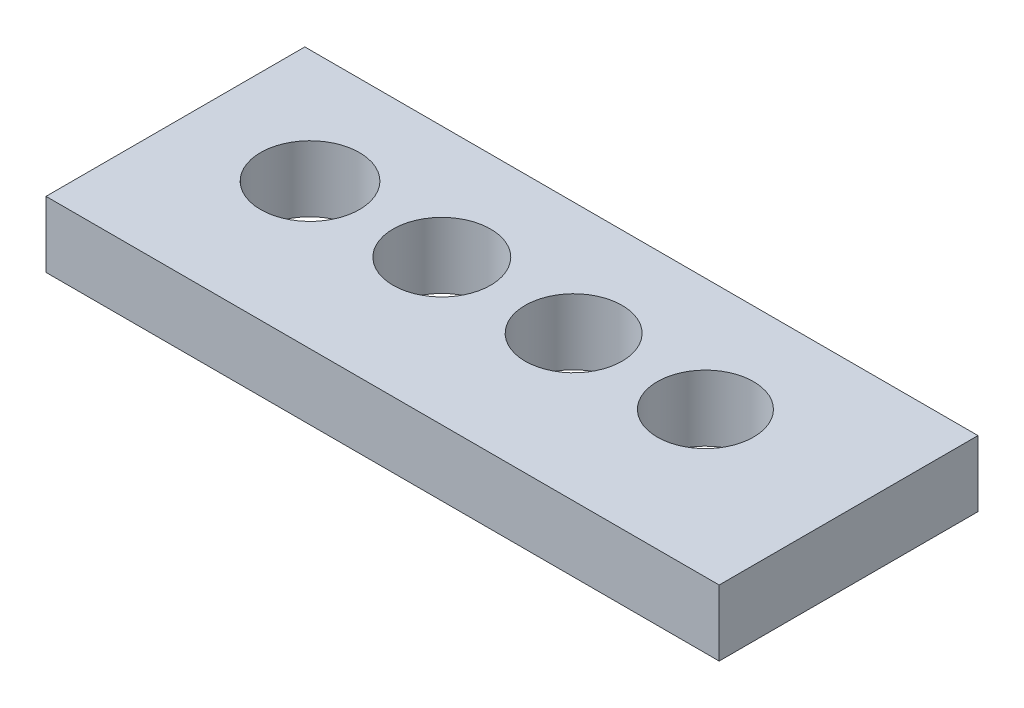
ISO-10303-21;
HEADER;
FILE_DESCRIPTION(('STEP AP214'),'2;1');
FILE_NAME('part.step','',(''),(''),'','','');
FILE_SCHEMA(('AUTOMOTIVE_DESIGN { 1 0 10303 214 1 1 1 1 }'));
ENDSEC;
DATA;
#1=APPLICATION_CONTEXT('core data for automotive mechanical design processes');
#2=APPLICATION_PROTOCOL_DEFINITION('international standard','automotive_design',2000,#1);
#3=PRODUCT_CONTEXT('',#1,'mechanical');
#4=PRODUCT('Part','Part','',(#3));
#5=PRODUCT_RELATED_PRODUCT_CATEGORY('part','',(#4));
#6=PRODUCT_DEFINITION_FORMATION('','',#4);
#7=PRODUCT_DEFINITION_CONTEXT('part definition',#1,'design');
#8=PRODUCT_DEFINITION('design','',#6,#7);
#9=PRODUCT_DEFINITION_SHAPE('','',#8);
#10=(LENGTH_UNIT() NAMED_UNIT(*) SI_UNIT(.MILLI.,.METRE.));
#11=(NAMED_UNIT(*) PLANE_ANGLE_UNIT() SI_UNIT($,.RADIAN.));
#12=(NAMED_UNIT(*) SI_UNIT($,.STERADIAN.) SOLID_ANGLE_UNIT());
#13=UNCERTAINTY_MEASURE_WITH_UNIT(LENGTH_MEASURE(1.E-05),#10,'distance_accuracy_value','');
#14=(GEOMETRIC_REPRESENTATION_CONTEXT(3) GLOBAL_UNCERTAINTY_ASSIGNED_CONTEXT((#13)) GLOBAL_UNIT_ASSIGNED_CONTEXT((#10,
#11,#12)) REPRESENTATION_CONTEXT('',''));
#15=CARTESIAN_POINT('',(0.,0.,0.));
#16=DIRECTION('',(0.,0.,1.));
#17=DIRECTION('',(1.,0.,0.));
#18=AXIS2_PLACEMENT_3D('',#15,#16,#17);
#19=CARTESIAN_POINT('',(0.,10.,0.));
#20=DIRECTION('',(0.,1.,0.));
#21=DIRECTION('',(0.,0.,1.));
#22=AXIS2_PLACEMENT_3D('',#19,#20,#21);
#23=PLANE('',#22);
#24=CARTESIAN_POINT('',(40.,10.,0.));
#25=DIRECTION('',(0.,1.,0.));
#26=DIRECTION('',(0.,0.,1.));
#27=AXIS2_PLACEMENT_3D('',#24,#25,#26);
#28=CIRCLE('',#27,7.35);
#29=CARTESIAN_POINT('',(40.,10.,7.35));
#30=VERTEX_POINT('',#29);
#31=EDGE_CURVE('E148',#30,#30,#28,.T.);
#32=ORIENTED_EDGE('',*,*,#31,.F.);
#33=EDGE_LOOP('',(#32));
#34=FACE_BOUND('',#33,.T.);
#35=CARTESIAN_POINT('',(0.,10.,0.));
#36=DIRECTION('',(0.,1.,0.));
#37=DIRECTION('',(0.,0.,1.));
#38=AXIS2_PLACEMENT_3D('',#35,#36,#37);
#39=CIRCLE('',#38,7.5);
#40=CARTESIAN_POINT('',(0.,10.,7.5));
#41=VERTEX_POINT('',#40);
#42=EDGE_CURVE('E118',#41,#41,#39,.T.);
#43=ORIENTED_EDGE('',*,*,#42,.F.);
#44=EDGE_LOOP('',(#43));
#45=FACE_BOUND('',#44,.T.);
#46=DIRECTION('',(0.,0.,1.));
#47=VECTOR('',#46,1.);
#48=CARTESIAN_POINT('',(-18.0231428682837,10.,-17.2360788414747));
#49=LINE('',#48,#47);
#50=CARTESIAN_POINT('',(-18.0231428682837,10.,-17.2360788414747));
#51=VERTEX_POINT('',#50);
#52=CARTESIAN_POINT('',(-18.0231428682837,10.,22.0384630163242));
#53=VERTEX_POINT('',#52);
#54=EDGE_CURVE('E98',#51,#53,#49,.T.);
#55=ORIENTED_EDGE('',*,*,#54,.T.);
#56=DIRECTION('',(1.,0.,0.));
#57=VECTOR('',#56,1.);
#58=CARTESIAN_POINT('',(-18.0231428682837,10.,22.0384630163242));
#59=LINE('',#58,#57);
#60=CARTESIAN_POINT('',(84.1236697786808,10.,22.0384630163242));
#61=VERTEX_POINT('',#60);
#62=EDGE_CURVE('E93',#53,#61,#59,.T.);
#63=ORIENTED_EDGE('',*,*,#62,.T.);
#64=DIRECTION('',(0.,0.,-1.));
#65=VECTOR('',#64,1.);
#66=CARTESIAN_POINT('',(84.1236697786808,10.,-17.2360788414747));
#67=LINE('',#66,#65);
#68=CARTESIAN_POINT('',(84.1236697786808,10.,-17.2360788414747));
#69=VERTEX_POINT('',#68);
#70=EDGE_CURVE('E96',#61,#69,#67,.T.);
#71=ORIENTED_EDGE('',*,*,#70,.T.);
#72=DIRECTION('',(-1.,0.,0.));
#73=VECTOR('',#72,1.);
#74=CARTESIAN_POINT('',(-18.0231428682837,10.,-17.2360788414747));
#75=LINE('',#74,#73);
#76=EDGE_CURVE('E63',#69,#51,#75,.T.);
#77=ORIENTED_EDGE('',*,*,#76,.T.);
#78=EDGE_LOOP('',(#55,#63,#71,#77));
#79=FACE_BOUND('',#78,.T.);
#80=CARTESIAN_POINT('',(20.,10.,0.));
#81=DIRECTION('',(0.,1.,0.));
#82=DIRECTION('',(0.,0.,1.));
#83=AXIS2_PLACEMENT_3D('',#80,#81,#82);
#84=CIRCLE('',#83,7.40000000000001);
#85=CARTESIAN_POINT('',(20.,10.,7.40000000000001));
#86=VERTEX_POINT('',#85);
#87=EDGE_CURVE('E140',#86,#86,#84,.T.);
#88=ORIENTED_EDGE('',*,*,#87,.F.);
#89=EDGE_LOOP('',(#88));
#90=FACE_BOUND('',#89,.T.);
#91=CARTESIAN_POINT('',(60.,10.,0.));
#92=DIRECTION('',(0.,1.,0.));
#93=DIRECTION('',(0.,0.,1.));
#94=AXIS2_PLACEMENT_3D('',#91,#92,#93);
#95=CIRCLE('',#94,7.3);
#96=CARTESIAN_POINT('',(60.,10.,7.3));
#97=VERTEX_POINT('',#96);
#98=EDGE_CURVE('E156',#97,#97,#95,.T.);
#99=ORIENTED_EDGE('',*,*,#98,.F.);
#100=EDGE_LOOP('',(#99));
#101=FACE_BOUND('',#100,.T.);
#102=ADVANCED_FACE('F45',(#34,#45,#79,#90,#101),#23,.T.);
#103=CARTESIAN_POINT('',(0.,0.,0.));
#104=DIRECTION('',(0.,1.,0.));
#105=DIRECTION('',(0.,0.,1.));
#106=AXIS2_PLACEMENT_3D('',#103,#104,#105);
#107=PLANE('',#106);
#108=DIRECTION('',(0.,0.,1.));
#109=VECTOR('',#108,1.);
#110=CARTESIAN_POINT('',(-18.0231428682837,0.,-17.2360788414747));
#111=LINE('',#110,#109);
#112=CARTESIAN_POINT('',(-18.0231428682837,0.,-17.2360788414747));
#113=VERTEX_POINT('',#112);
#114=CARTESIAN_POINT('',(-18.0231428682837,0.,22.0384630163242));
#115=VERTEX_POINT('',#114);
#116=EDGE_CURVE('E114',#113,#115,#111,.T.);
#117=ORIENTED_EDGE('',*,*,#116,.F.);
#118=DIRECTION('',(-1.,0.,0.));
#119=VECTOR('',#118,1.);
#120=CARTESIAN_POINT('',(-18.0231428682837,0.,-17.2360788414747));
#121=LINE('',#120,#119);
#122=CARTESIAN_POINT('',(84.1236697786808,0.,-17.2360788414747));
#123=VERTEX_POINT('',#122);
#124=EDGE_CURVE('E86',#123,#113,#121,.T.);
#125=ORIENTED_EDGE('',*,*,#124,.F.);
#126=DIRECTION('',(0.,0.,-1.));
#127=VECTOR('',#126,1.);
#128=CARTESIAN_POINT('',(84.1236697786808,0.,-17.2360788414747));
#129=LINE('',#128,#127);
#130=CARTESIAN_POINT('',(84.1236697786808,0.,22.0384630163242));
#131=VERTEX_POINT('',#130);
#132=EDGE_CURVE('E80',#131,#123,#129,.T.);
#133=ORIENTED_EDGE('',*,*,#132,.F.);
#134=DIRECTION('',(1.,0.,0.));
#135=VECTOR('',#134,1.);
#136=CARTESIAN_POINT('',(-18.0231428682837,0.,22.0384630163242));
#137=LINE('',#136,#135);
#138=EDGE_CURVE('E103',#115,#131,#137,.T.);
#139=ORIENTED_EDGE('',*,*,#138,.F.);
#140=EDGE_LOOP('',(#117,#125,#133,#139));
#141=FACE_BOUND('',#140,.T.);
#142=CARTESIAN_POINT('',(0.,0.,0.));
#143=DIRECTION('',(0.,1.,0.));
#144=DIRECTION('',(0.,0.,1.));
#145=AXIS2_PLACEMENT_3D('',#142,#143,#144);
#146=CIRCLE('',#145,7.5);
#147=CARTESIAN_POINT('',(0.,0.,7.5));
#148=VERTEX_POINT('',#147);
#149=EDGE_CURVE('E136',#148,#148,#146,.T.);
#150=ORIENTED_EDGE('',*,*,#149,.T.);
#151=EDGE_LOOP('',(#150));
#152=FACE_BOUND('',#151,.T.);
#153=CARTESIAN_POINT('',(20.,0.,0.));
#154=DIRECTION('',(0.,1.,0.));
#155=DIRECTION('',(0.,0.,1.));
#156=AXIS2_PLACEMENT_3D('',#153,#154,#155);
#157=CIRCLE('',#156,7.40000000000001);
#158=CARTESIAN_POINT('',(20.,0.,7.40000000000001));
#159=VERTEX_POINT('',#158);
#160=EDGE_CURVE('E144',#159,#159,#157,.T.);
#161=ORIENTED_EDGE('',*,*,#160,.T.);
#162=EDGE_LOOP('',(#161));
#163=FACE_BOUND('',#162,.T.);
#164=CARTESIAN_POINT('',(40.,0.,0.));
#165=DIRECTION('',(0.,1.,0.));
#166=DIRECTION('',(0.,0.,1.));
#167=AXIS2_PLACEMENT_3D('',#164,#165,#166);
#168=CIRCLE('',#167,7.35);
#169=CARTESIAN_POINT('',(40.,0.,7.35));
#170=VERTEX_POINT('',#169);
#171=EDGE_CURVE('E152',#170,#170,#168,.T.);
#172=ORIENTED_EDGE('',*,*,#171,.T.);
#173=EDGE_LOOP('',(#172));
#174=FACE_BOUND('',#173,.T.);
#175=CARTESIAN_POINT('',(60.,0.,0.));
#176=DIRECTION('',(0.,1.,0.));
#177=DIRECTION('',(0.,0.,1.));
#178=AXIS2_PLACEMENT_3D('',#175,#176,#177);
#179=CIRCLE('',#178,7.3);
#180=CARTESIAN_POINT('',(60.,0.,7.3));
#181=VERTEX_POINT('',#180);
#182=EDGE_CURVE('E160',#181,#181,#179,.T.);
#183=ORIENTED_EDGE('',*,*,#182,.T.);
#184=EDGE_LOOP('',(#183));
#185=FACE_BOUND('',#184,.T.);
#186=ADVANCED_FACE('F131',(#141,#152,#163,#174,#185),#107,.F.);
#187=CARTESIAN_POINT('',(-18.0231428682837,10.,-17.2360788414747));
#188=DIRECTION('',(1.,0.,0.));
#189=DIRECTION('',(0.,0.,-1.));
#190=AXIS2_PLACEMENT_3D('',#187,#188,#189);
#191=PLANE('',#190);
#192=ORIENTED_EDGE('',*,*,#116,.T.);
#193=DIRECTION('',(0.,-1.,0.));
#194=VECTOR('',#193,1.);
#195=CARTESIAN_POINT('',(-18.0231428682837,10.,22.0384630163242));
#196=LINE('',#195,#194);
#197=EDGE_CURVE('E11',#53,#115,#196,.T.);
#198=ORIENTED_EDGE('',*,*,#197,.F.);
#199=ORIENTED_EDGE('',*,*,#54,.F.);
#200=DIRECTION('',(0.,-1.,0.));
#201=VECTOR('',#200,1.);
#202=CARTESIAN_POINT('',(-18.0231428682837,10.,-17.2360788414747));
#203=LINE('',#202,#201);
#204=EDGE_CURVE('E110',#51,#113,#203,.T.);
#205=ORIENTED_EDGE('',*,*,#204,.T.);
#206=EDGE_LOOP('',(#192,#198,#199,#205));
#207=FACE_BOUND('',#206,.T.);
#208=ADVANCED_FACE('F47',(#207),#191,.F.);
#209=CARTESIAN_POINT('',(-18.0231428682837,10.,22.0384630163242));
#210=DIRECTION('',(0.,0.,-1.));
#211=DIRECTION('',(-1.,0.,0.));
#212=AXIS2_PLACEMENT_3D('',#209,#210,#211);
#213=PLANE('',#212);
#214=ORIENTED_EDGE('',*,*,#138,.T.);
#215=DIRECTION('',(0.,-1.,0.));
#216=VECTOR('',#215,1.);
#217=CARTESIAN_POINT('',(84.1236697786808,10.,22.0384630163242));
#218=LINE('',#217,#216);
#219=EDGE_CURVE('E55',#61,#131,#218,.T.);
#220=ORIENTED_EDGE('',*,*,#219,.F.);
#221=ORIENTED_EDGE('',*,*,#62,.F.);
#222=ORIENTED_EDGE('',*,*,#197,.T.);
#223=EDGE_LOOP('',(#214,#220,#221,#222));
#224=FACE_BOUND('',#223,.T.);
#225=ADVANCED_FACE('F102',(#224),#213,.F.);
#226=CARTESIAN_POINT('',(84.1236697786808,10.,-17.2360788414747));
#227=DIRECTION('',(-1.,0.,0.));
#228=DIRECTION('',(0.,0.,1.));
#229=AXIS2_PLACEMENT_3D('',#226,#227,#228);
#230=PLANE('',#229);
#231=ORIENTED_EDGE('',*,*,#132,.T.);
#232=DIRECTION('',(0.,-1.,0.));
#233=VECTOR('',#232,1.);
#234=CARTESIAN_POINT('',(84.1236697786808,10.,-17.2360788414747));
#235=LINE('',#234,#233);
#236=EDGE_CURVE('E105',#69,#123,#235,.T.);
#237=ORIENTED_EDGE('',*,*,#236,.F.);
#238=ORIENTED_EDGE('',*,*,#70,.F.);
#239=ORIENTED_EDGE('',*,*,#219,.T.);
#240=EDGE_LOOP('',(#231,#237,#238,#239));
#241=FACE_BOUND('',#240,.T.);
#242=ADVANCED_FACE('F106',(#241),#230,.F.);
#243=CARTESIAN_POINT('',(-18.0231428682837,10.,-17.2360788414747));
#244=DIRECTION('',(0.,0.,1.));
#245=DIRECTION('',(1.,0.,0.));
#246=AXIS2_PLACEMENT_3D('',#243,#244,#245);
#247=PLANE('',#246);
#248=ORIENTED_EDGE('',*,*,#124,.T.);
#249=ORIENTED_EDGE('',*,*,#204,.F.);
#250=ORIENTED_EDGE('',*,*,#76,.F.);
#251=ORIENTED_EDGE('',*,*,#236,.T.);
#252=EDGE_LOOP('',(#248,#249,#250,#251));
#253=FACE_BOUND('',#252,.T.);
#254=ADVANCED_FACE('F128',(#253),#247,.F.);
#255=CARTESIAN_POINT('',(0.,10.,0.));
#256=DIRECTION('',(0.,-1.,0.));
#257=DIRECTION('',(0.,0.,-1.));
#258=AXIS2_PLACEMENT_3D('',#255,#256,#257);
#259=CYLINDRICAL_SURFACE('',#258,7.5);
#260=ORIENTED_EDGE('',*,*,#42,.T.);
#261=EDGE_LOOP('',(#260));
#262=FACE_BOUND('',#261,.T.);
#263=ORIENTED_EDGE('',*,*,#149,.F.);
#264=EDGE_LOOP('',(#263));
#265=FACE_BOUND('',#264,.T.);
#266=ADVANCED_FACE('F181',(#262,#265),#259,.F.);
#267=CARTESIAN_POINT('',(20.,10.,0.));
#268=DIRECTION('',(0.,-1.,0.));
#269=DIRECTION('',(0.,0.,-1.));
#270=AXIS2_PLACEMENT_3D('',#267,#268,#269);
#271=CYLINDRICAL_SURFACE('',#270,7.40000000000001);
#272=ORIENTED_EDGE('',*,*,#87,.T.);
#273=EDGE_LOOP('',(#272));
#274=FACE_BOUND('',#273,.T.);
#275=ORIENTED_EDGE('',*,*,#160,.F.);
#276=EDGE_LOOP('',(#275));
#277=FACE_BOUND('',#276,.T.);
#278=ADVANCED_FACE('F226',(#274,#277),#271,.F.);
#279=CARTESIAN_POINT('',(40.,10.,0.));
#280=DIRECTION('',(0.,-1.,0.));
#281=DIRECTION('',(0.,0.,-1.));
#282=AXIS2_PLACEMENT_3D('',#279,#280,#281);
#283=CYLINDRICAL_SURFACE('',#282,7.35);
#284=ORIENTED_EDGE('',*,*,#31,.T.);
#285=EDGE_LOOP('',(#284));
#286=FACE_BOUND('',#285,.T.);
#287=ORIENTED_EDGE('',*,*,#171,.F.);
#288=EDGE_LOOP('',(#287));
#289=FACE_BOUND('',#288,.T.);
#290=ADVANCED_FACE('F234',(#286,#289),#283,.F.);
#291=CARTESIAN_POINT('',(60.,10.,0.));
#292=DIRECTION('',(0.,-1.,0.));
#293=DIRECTION('',(0.,0.,-1.));
#294=AXIS2_PLACEMENT_3D('',#291,#292,#293);
#295=CYLINDRICAL_SURFACE('',#294,7.3);
#296=ORIENTED_EDGE('',*,*,#98,.T.);
#297=EDGE_LOOP('',(#296));
#298=FACE_BOUND('',#297,.T.);
#299=ORIENTED_EDGE('',*,*,#182,.F.);
#300=EDGE_LOOP('',(#299));
#301=FACE_BOUND('',#300,.T.);
#302=ADVANCED_FACE('F168',(#298,#301),#295,.F.);
#303=CLOSED_SHELL('',(#102,#186,#208,#225,#242,#254,#266,#278,#290,#302));
#304=MANIFOLD_SOLID_BREP('B2',#303);
#305=ADVANCED_BREP_SHAPE_REPRESENTATION('',(#18,#304),#14);
#306=SHAPE_DEFINITION_REPRESENTATION(#9,#305);
ENDSEC;
END-ISO-10303-21;
